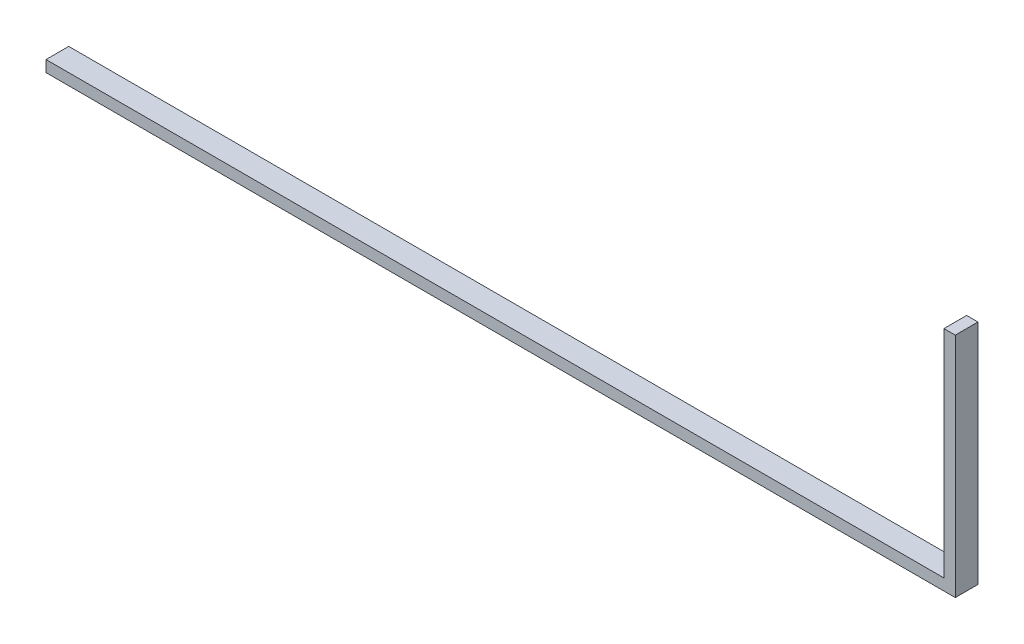
ISO-10303-21;
HEADER;
FILE_DESCRIPTION(('STEP AP214'),'2;1');
FILE_NAME('part.step','',(''),(''),'','','');
FILE_SCHEMA(('AUTOMOTIVE_DESIGN { 1 0 10303 214 1 1 1 1 }'));
ENDSEC;
DATA;
#1=APPLICATION_CONTEXT('core data for automotive mechanical design processes');
#2=APPLICATION_PROTOCOL_DEFINITION('international standard','automotive_design',2000,#1);
#3=PRODUCT_CONTEXT('',#1,'mechanical');
#4=PRODUCT('Part','Part','',(#3));
#5=PRODUCT_RELATED_PRODUCT_CATEGORY('part','',(#4));
#6=PRODUCT_DEFINITION_FORMATION('','',#4);
#7=PRODUCT_DEFINITION_CONTEXT('part definition',#1,'design');
#8=PRODUCT_DEFINITION('design','',#6,#7);
#9=PRODUCT_DEFINITION_SHAPE('','',#8);
#10=(LENGTH_UNIT() NAMED_UNIT(*) SI_UNIT(.MILLI.,.METRE.));
#11=(NAMED_UNIT(*) PLANE_ANGLE_UNIT() SI_UNIT($,.RADIAN.));
#12=(NAMED_UNIT(*) SI_UNIT($,.STERADIAN.) SOLID_ANGLE_UNIT());
#13=UNCERTAINTY_MEASURE_WITH_UNIT(LENGTH_MEASURE(1.E-05),#10,'distance_accuracy_value','');
#14=(GEOMETRIC_REPRESENTATION_CONTEXT(3) GLOBAL_UNCERTAINTY_ASSIGNED_CONTEXT((#13)) GLOBAL_UNIT_ASSIGNED_CONTEXT((#10,
#11,#12)) REPRESENTATION_CONTEXT('',''));
#15=CARTESIAN_POINT('',(0.,0.,0.));
#16=DIRECTION('',(0.,0.,1.));
#17=DIRECTION('',(1.,0.,0.));
#18=AXIS2_PLACEMENT_3D('',#15,#16,#17);
#19=CARTESIAN_POINT('',(0.,50.,100.));
#20=DIRECTION('',(1.,0.,0.));
#21=DIRECTION('',(0.,0.,-1.));
#22=AXIS2_PLACEMENT_3D('',#19,#20,#21);
#23=PLANE('',#22);
#24=DIRECTION('',(0.,-1.,0.));
#25=VECTOR('',#24,1.);
#26=CARTESIAN_POINT('',(0.,50.,0.));
#27=LINE('',#26,#25);
#28=CARTESIAN_POINT('',(0.,50.,0.));
#29=VERTEX_POINT('',#28);
#30=CARTESIAN_POINT('',(0.,0.,0.));
#31=VERTEX_POINT('',#30);
#32=EDGE_CURVE('E132',#29,#31,#27,.T.);
#33=ORIENTED_EDGE('',*,*,#32,.T.);
#34=DIRECTION('',(0.,0.,-1.));
#35=VECTOR('',#34,1.);
#36=CARTESIAN_POINT('',(0.,0.,100.));
#37=LINE('',#36,#35);
#38=CARTESIAN_POINT('',(0.,0.,100.));
#39=VERTEX_POINT('',#38);
#40=EDGE_CURVE('E11',#39,#31,#37,.T.);
#41=ORIENTED_EDGE('',*,*,#40,.F.);
#42=DIRECTION('',(0.,-1.,0.));
#43=VECTOR('',#42,1.);
#44=CARTESIAN_POINT('',(0.,50.,100.));
#45=LINE('',#44,#43);
#46=CARTESIAN_POINT('',(0.,50.,100.));
#47=VERTEX_POINT('',#46);
#48=EDGE_CURVE('E148',#47,#39,#45,.T.);
#49=ORIENTED_EDGE('',*,*,#48,.F.);
#50=DIRECTION('',(0.,0.,-1.));
#51=VECTOR('',#50,1.);
#52=CARTESIAN_POINT('',(0.,50.,100.));
#53=LINE('',#52,#51);
#54=EDGE_CURVE('E128',#47,#29,#53,.T.);
#55=ORIENTED_EDGE('',*,*,#54,.T.);
#56=EDGE_LOOP('',(#33,#41,#49,#55));
#57=FACE_BOUND('',#56,.T.);
#58=ADVANCED_FACE('F43',(#57),#23,.F.);
#59=CARTESIAN_POINT('',(0.,0.,100.));
#60=DIRECTION('',(0.,1.,0.));
#61=DIRECTION('',(0.,0.,1.));
#62=AXIS2_PLACEMENT_3D('',#59,#60,#61);
#63=PLANE('',#62);
#64=DIRECTION('',(1.,0.,0.));
#65=VECTOR('',#64,1.);
#66=CARTESIAN_POINT('',(0.,0.,0.));
#67=LINE('',#66,#65);
#68=CARTESIAN_POINT('',(4000.,0.,0.));
#69=VERTEX_POINT('',#68);
#70=EDGE_CURVE('E136',#31,#69,#67,.T.);
#71=ORIENTED_EDGE('',*,*,#70,.T.);
#72=DIRECTION('',(0.,0.,-1.));
#73=VECTOR('',#72,1.);
#74=CARTESIAN_POINT('',(4000.,0.,100.));
#75=LINE('',#74,#73);
#76=CARTESIAN_POINT('',(4000.,0.,100.));
#77=VERTEX_POINT('',#76);
#78=EDGE_CURVE('E52',#77,#69,#75,.T.);
#79=ORIENTED_EDGE('',*,*,#78,.F.);
#80=DIRECTION('',(1.,0.,0.));
#81=VECTOR('',#80,1.);
#82=CARTESIAN_POINT('',(0.,0.,100.));
#83=LINE('',#82,#81);
#84=EDGE_CURVE('E97',#39,#77,#83,.T.);
#85=ORIENTED_EDGE('',*,*,#84,.F.);
#86=ORIENTED_EDGE('',*,*,#40,.T.);
#87=EDGE_LOOP('',(#71,#79,#85,#86));
#88=FACE_BOUND('',#87,.T.);
#89=ADVANCED_FACE('F176',(#88),#63,.F.);
#90=CARTESIAN_POINT('',(4000.,0.,100.));
#91=DIRECTION('',(-1.,0.,0.));
#92=DIRECTION('',(0.,0.,1.));
#93=AXIS2_PLACEMENT_3D('',#90,#91,#92);
#94=PLANE('',#93);
#95=DIRECTION('',(0.,1.,0.));
#96=VECTOR('',#95,1.);
#97=CARTESIAN_POINT('',(4000.,0.,0.));
#98=LINE('',#97,#96);
#99=CARTESIAN_POINT('',(4000.,1000.,0.));
#100=VERTEX_POINT('',#99);
#101=EDGE_CURVE('E139',#69,#100,#98,.T.);
#102=ORIENTED_EDGE('',*,*,#101,.T.);
#103=DIRECTION('',(0.,0.,-1.));
#104=VECTOR('',#103,1.);
#105=CARTESIAN_POINT('',(4000.,1000.,100.));
#106=LINE('',#105,#104);
#107=CARTESIAN_POINT('',(4000.,1000.,100.));
#108=VERTEX_POINT('',#107);
#109=EDGE_CURVE('E121',#108,#100,#106,.T.);
#110=ORIENTED_EDGE('',*,*,#109,.F.);
#111=DIRECTION('',(0.,1.,0.));
#112=VECTOR('',#111,1.);
#113=CARTESIAN_POINT('',(4000.,0.,100.));
#114=LINE('',#113,#112);
#115=EDGE_CURVE('E110',#77,#108,#114,.T.);
#116=ORIENTED_EDGE('',*,*,#115,.F.);
#117=ORIENTED_EDGE('',*,*,#78,.T.);
#118=EDGE_LOOP('',(#102,#110,#116,#117));
#119=FACE_BOUND('',#118,.T.);
#120=ADVANCED_FACE('F158',(#119),#94,.F.);
#121=CARTESIAN_POINT('',(4000.,1000.,100.));
#122=DIRECTION('',(0.,-1.,0.));
#123=DIRECTION('',(0.,0.,-1.));
#124=AXIS2_PLACEMENT_3D('',#121,#122,#123);
#125=PLANE('',#124);
#126=DIRECTION('',(-1.,0.,0.));
#127=VECTOR('',#126,1.);
#128=CARTESIAN_POINT('',(4000.,1000.,0.));
#129=LINE('',#128,#127);
#130=CARTESIAN_POINT('',(3950.,1000.,0.));
#131=VERTEX_POINT('',#130);
#132=EDGE_CURVE('E119',#100,#131,#129,.T.);
#133=ORIENTED_EDGE('',*,*,#132,.T.);
#134=DIRECTION('',(0.,0.,-1.));
#135=VECTOR('',#134,1.);
#136=CARTESIAN_POINT('',(3950.,1000.,100.));
#137=LINE('',#136,#135);
#138=CARTESIAN_POINT('',(3950.,1000.,100.));
#139=VERTEX_POINT('',#138);
#140=EDGE_CURVE('E116',#139,#131,#137,.T.);
#141=ORIENTED_EDGE('',*,*,#140,.F.);
#142=DIRECTION('',(-1.,0.,0.));
#143=VECTOR('',#142,1.);
#144=CARTESIAN_POINT('',(4000.,1000.,100.));
#145=LINE('',#144,#143);
#146=EDGE_CURVE('E104',#108,#139,#145,.T.);
#147=ORIENTED_EDGE('',*,*,#146,.F.);
#148=ORIENTED_EDGE('',*,*,#109,.T.);
#149=EDGE_LOOP('',(#133,#141,#147,#148));
#150=FACE_BOUND('',#149,.T.);
#151=ADVANCED_FACE('F117',(#150),#125,.F.);
#152=CARTESIAN_POINT('',(3950.,1000.,100.));
#153=DIRECTION('',(1.,0.,0.));
#154=DIRECTION('',(0.,0.,-1.));
#155=AXIS2_PLACEMENT_3D('',#152,#153,#154);
#156=PLANE('',#155);
#157=DIRECTION('',(0.,-1.,0.));
#158=VECTOR('',#157,1.);
#159=CARTESIAN_POINT('',(3950.,1000.,0.));
#160=LINE('',#159,#158);
#161=CARTESIAN_POINT('',(3950.,50.0000000000005,0.));
#162=VERTEX_POINT('',#161);
#163=EDGE_CURVE('E83',#131,#162,#160,.T.);
#164=ORIENTED_EDGE('',*,*,#163,.T.);
#165=DIRECTION('',(0.,0.,-1.));
#166=VECTOR('',#165,1.);
#167=CARTESIAN_POINT('',(3950.,50.0000000000005,100.));
#168=LINE('',#167,#166);
#169=CARTESIAN_POINT('',(3950.,50.0000000000005,100.));
#170=VERTEX_POINT('',#169);
#171=EDGE_CURVE('E122',#170,#162,#168,.T.);
#172=ORIENTED_EDGE('',*,*,#171,.F.);
#173=DIRECTION('',(0.,-1.,0.));
#174=VECTOR('',#173,1.);
#175=CARTESIAN_POINT('',(3950.,1000.,100.));
#176=LINE('',#175,#174);
#177=EDGE_CURVE('E108',#139,#170,#176,.T.);
#178=ORIENTED_EDGE('',*,*,#177,.F.);
#179=ORIENTED_EDGE('',*,*,#140,.T.);
#180=EDGE_LOOP('',(#164,#172,#178,#179));
#181=FACE_BOUND('',#180,.T.);
#182=ADVANCED_FACE('F124',(#181),#156,.F.);
#183=CARTESIAN_POINT('',(3950.,50.0000000000005,100.));
#184=DIRECTION('',(0.,-1.,0.));
#185=DIRECTION('',(1.,0.,0.));
#186=AXIS2_PLACEMENT_3D('',#183,#184,#185);
#187=PLANE('',#186);
#188=DIRECTION('',(-1.,0.,0.));
#189=VECTOR('',#188,1.);
#190=CARTESIAN_POINT('',(3950.,50.0000000000005,0.));
#191=LINE('',#190,#189);
#192=EDGE_CURVE('E89',#162,#29,#191,.T.);
#193=ORIENTED_EDGE('',*,*,#192,.T.);
#194=ORIENTED_EDGE('',*,*,#54,.F.);
#195=DIRECTION('',(-1.,0.,0.));
#196=VECTOR('',#195,1.);
#197=CARTESIAN_POINT('',(3950.,50.0000000000005,100.));
#198=LINE('',#197,#196);
#199=EDGE_CURVE('E60',#170,#47,#198,.T.);
#200=ORIENTED_EDGE('',*,*,#199,.F.);
#201=ORIENTED_EDGE('',*,*,#171,.T.);
#202=EDGE_LOOP('',(#193,#194,#200,#201));
#203=FACE_BOUND('',#202,.T.);
#204=ADVANCED_FACE('F165',(#203),#187,.F.);
#205=CARTESIAN_POINT('',(0.,0.,100.));
#206=DIRECTION('',(0.,0.,1.));
#207=DIRECTION('',(1.,0.,0.));
#208=AXIS2_PLACEMENT_3D('',#205,#206,#207);
#209=PLANE('',#208);
#210=ORIENTED_EDGE('',*,*,#48,.T.);
#211=ORIENTED_EDGE('',*,*,#84,.T.);
#212=ORIENTED_EDGE('',*,*,#115,.T.);
#213=ORIENTED_EDGE('',*,*,#146,.T.);
#214=ORIENTED_EDGE('',*,*,#177,.T.);
#215=ORIENTED_EDGE('',*,*,#199,.T.);
#216=EDGE_LOOP('',(#210,#211,#212,#213,#214,#215));
#217=FACE_BOUND('',#216,.T.);
#218=ADVANCED_FACE('F106',(#217),#209,.T.);
#219=CARTESIAN_POINT('',(0.,0.,0.));
#220=DIRECTION('',(0.,0.,1.));
#221=DIRECTION('',(1.,0.,0.));
#222=AXIS2_PLACEMENT_3D('',#219,#220,#221);
#223=PLANE('',#222);
#224=ORIENTED_EDGE('',*,*,#32,.F.);
#225=ORIENTED_EDGE('',*,*,#192,.F.);
#226=ORIENTED_EDGE('',*,*,#163,.F.);
#227=ORIENTED_EDGE('',*,*,#132,.F.);
#228=ORIENTED_EDGE('',*,*,#101,.F.);
#229=ORIENTED_EDGE('',*,*,#70,.F.);
#230=EDGE_LOOP('',(#224,#225,#226,#227,#228,#229));
#231=FACE_BOUND('',#230,.T.);
#232=ADVANCED_FACE('F161',(#231),#223,.F.);
#233=CLOSED_SHELL('',(#58,#89,#120,#151,#182,#204,#218,#232));
#234=MANIFOLD_SOLID_BREP('B2',#233);
#235=ADVANCED_BREP_SHAPE_REPRESENTATION('',(#18,#234),#14);
#236=SHAPE_DEFINITION_REPRESENTATION(#9,#235);
ENDSEC;
END-ISO-10303-21;
